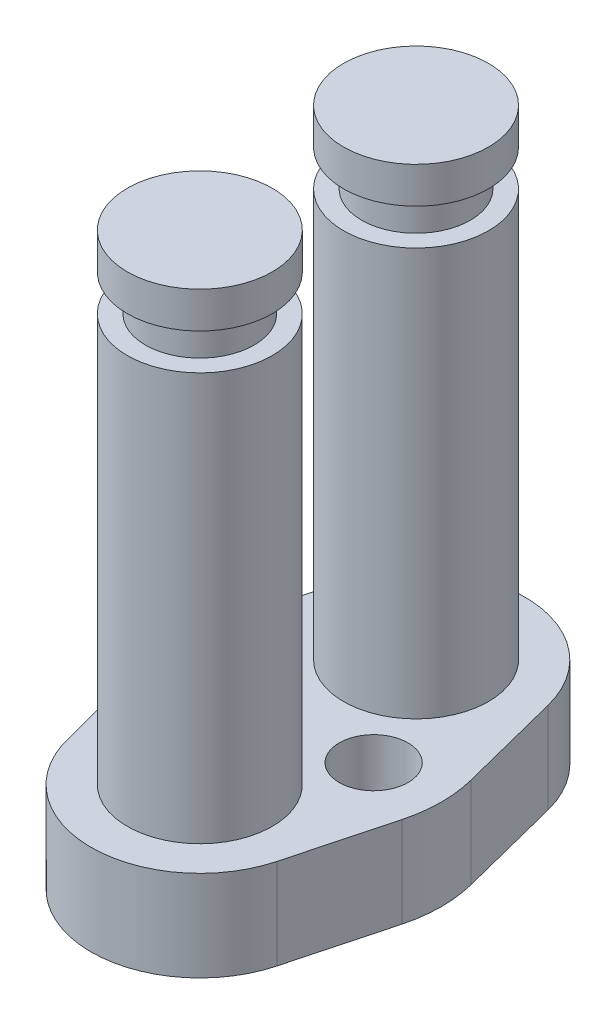
ISO-10303-21;
HEADER;
FILE_DESCRIPTION(('STEP AP214'),'2;1');
FILE_NAME('part.step','',(''),(''),'','','');
FILE_SCHEMA(('AUTOMOTIVE_DESIGN { 1 0 10303 214 1 1 1 1 }'));
ENDSEC;
DATA;
#1=APPLICATION_CONTEXT('core data for automotive mechanical design processes');
#2=APPLICATION_PROTOCOL_DEFINITION('international standard','automotive_design',2000,#1);
#3=PRODUCT_CONTEXT('',#1,'mechanical');
#4=PRODUCT('Part','Part','',(#3));
#5=PRODUCT_RELATED_PRODUCT_CATEGORY('part','',(#4));
#6=PRODUCT_DEFINITION_FORMATION('','',#4);
#7=PRODUCT_DEFINITION_CONTEXT('part definition',#1,'design');
#8=PRODUCT_DEFINITION('design','',#6,#7);
#9=PRODUCT_DEFINITION_SHAPE('','',#8);
#10=(LENGTH_UNIT() NAMED_UNIT(*) SI_UNIT(.MILLI.,.METRE.));
#11=(NAMED_UNIT(*) PLANE_ANGLE_UNIT() SI_UNIT($,.RADIAN.));
#12=(NAMED_UNIT(*) SI_UNIT($,.STERADIAN.) SOLID_ANGLE_UNIT());
#13=UNCERTAINTY_MEASURE_WITH_UNIT(LENGTH_MEASURE(1.E-05),#10,'distance_accuracy_value','');
#14=(GEOMETRIC_REPRESENTATION_CONTEXT(3) GLOBAL_UNCERTAINTY_ASSIGNED_CONTEXT((#13)) GLOBAL_UNIT_ASSIGNED_CONTEXT((#10,
#11,#12)) REPRESENTATION_CONTEXT('',''));
#15=CARTESIAN_POINT('',(0.,0.,0.));
#16=DIRECTION('',(0.,0.,1.));
#17=DIRECTION('',(1.,0.,0.));
#18=AXIS2_PLACEMENT_3D('',#15,#16,#17);
#19=CARTESIAN_POINT('',(10.7914021707681,5.,-2.7425994459952));
#20=DIRECTION('',(-0.969189489495146,0.,0.246316328025849));
#21=DIRECTION('',(0.246316328025849,0.,0.969189489495146));
#22=AXIS2_PLACEMENT_3D('',#19,#20,#21);
#23=PLANE('',#22);
#24=DIRECTION('',(-0.246316328025849,0.,-0.969189489495146));
#25=VECTOR('',#24,1.);
#26=CARTESIAN_POINT('',(10.7914021707681,0.,-2.7425994459952));
#27=LINE('',#26,#25);
#28=CARTESIAN_POINT('',(11.0189211712136,0.,-1.84737246019386));
#29=VERTEX_POINT('',#28);
#30=CARTESIAN_POINT('',(9.56513693697088,0.,-7.56762824313138));
#31=VERTEX_POINT('',#30);
#32=EDGE_CURVE('E133',#29,#31,#27,.T.);
#33=ORIENTED_EDGE('',*,*,#32,.T.);
#34=DIRECTION('',(0.,-1.,0.));
#35=VECTOR('',#34,1.);
#36=CARTESIAN_POINT('',(9.56513693697088,5.,-7.56762824313138));
#37=LINE('',#36,#35);
#38=CARTESIAN_POINT('',(9.56513693697088,5.,-7.56762824313138));
#39=VERTEX_POINT('',#38);
#40=EDGE_CURVE('E38',#39,#31,#37,.T.);
#41=ORIENTED_EDGE('',*,*,#40,.F.);
#42=DIRECTION('',(-0.246316328025849,0.,-0.969189489495146));
#43=VECTOR('',#42,1.);
#44=CARTESIAN_POINT('',(10.7914021707681,5.,-2.7425994459952));
#45=LINE('',#44,#43);
#46=CARTESIAN_POINT('',(11.0189211712136,5.,-1.84737246019386));
#47=VERTEX_POINT('',#46);
#48=EDGE_CURVE('E149',#47,#39,#45,.T.);
#49=ORIENTED_EDGE('',*,*,#48,.F.);
#50=DIRECTION('',(0.,-1.,0.));
#51=VECTOR('',#50,1.);
#52=CARTESIAN_POINT('',(11.0189211712136,5.,-1.84737246019386));
#53=LINE('',#52,#51);
#54=EDGE_CURVE('E129',#47,#29,#53,.T.);
#55=ORIENTED_EDGE('',*,*,#54,.T.);
#56=EDGE_LOOP('',(#33,#41,#49,#55));
#57=FACE_BOUND('',#56,.T.);
#58=ADVANCED_FACE('F35',(#57),#23,.F.);
#59=CARTESIAN_POINT('',(3.75,5.,-6.08973027497629));
#60=DIRECTION('',(0.,-1.,0.));
#61=DIRECTION('',(0.,0.,-1.));
#62=AXIS2_PLACEMENT_3D('',#59,#60,#61);
#63=CYLINDRICAL_SURFACE('',#62,6.);
#64=CARTESIAN_POINT('',(3.75,0.,-6.08973027497629));
#65=DIRECTION('',(0.,1.,0.));
#66=DIRECTION('',(0.,0.,1.));
#67=AXIS2_PLACEMENT_3D('',#64,#65,#66);
#68=CIRCLE('',#67,6.);
#69=CARTESIAN_POINT('',(-2.06513693697088,0.,-7.56762824313138));
#70=VERTEX_POINT('',#69);
#71=EDGE_CURVE('E136',#31,#70,#68,.T.);
#72=ORIENTED_EDGE('',*,*,#71,.T.);
#73=DIRECTION('',(0.,-1.,0.));
#74=VECTOR('',#73,1.);
#75=CARTESIAN_POINT('',(-2.06513693697088,5.,-7.56762824313138));
#76=LINE('',#75,#74);
#77=CARTESIAN_POINT('',(-2.06513693697088,5.,-7.56762824313138));
#78=VERTEX_POINT('',#77);
#79=EDGE_CURVE('E158',#78,#70,#76,.T.);
#80=ORIENTED_EDGE('',*,*,#79,.F.);
#81=CARTESIAN_POINT('',(3.75,5.,-6.08973027497629));
#82=DIRECTION('',(0.,1.,0.));
#83=DIRECTION('',(0.,0.,1.));
#84=AXIS2_PLACEMENT_3D('',#81,#82,#83);
#85=CIRCLE('',#84,6.);
#86=EDGE_CURVE('E93',#39,#78,#85,.T.);
#87=ORIENTED_EDGE('',*,*,#86,.F.);
#88=ORIENTED_EDGE('',*,*,#40,.T.);
#89=EDGE_LOOP('',(#72,#80,#87,#88));
#90=FACE_BOUND('',#89,.T.);
#91=ADVANCED_FACE('F214',(#90),#63,.T.);
#92=CARTESIAN_POINT('',(-3.74644017165911,5.,-0.95214547439252));
#93=DIRECTION('',(0.969189489495147,0.,0.246316328025848));
#94=DIRECTION('',(0.246316328025848,0.,-0.969189489495147));
#95=AXIS2_PLACEMENT_3D('',#92,#93,#94);
#96=PLANE('',#95);
#97=DIRECTION('',(-0.246316328025848,0.,0.969189489495147));
#98=VECTOR('',#97,1.);
#99=CARTESIAN_POINT('',(-3.74644017165911,0.,-0.95214547439252));
#100=LINE('',#99,#98);
#101=CARTESIAN_POINT('',(-3.5189211712136,0.,-1.84737246019386));
#102=VERTEX_POINT('',#101);
#103=EDGE_CURVE('E139',#70,#102,#100,.T.);
#104=ORIENTED_EDGE('',*,*,#103,.T.);
#105=DIRECTION('',(0.,-1.,0.));
#106=VECTOR('',#105,1.);
#107=CARTESIAN_POINT('',(-3.5189211712136,5.,-1.84737246019386));
#108=LINE('',#107,#106);
#109=CARTESIAN_POINT('',(-3.5189211712136,5.,-1.84737246019386));
#110=VERTEX_POINT('',#109);
#111=EDGE_CURVE('E156',#110,#102,#108,.T.);
#112=ORIENTED_EDGE('',*,*,#111,.F.);
#113=DIRECTION('',(-0.246316328025848,0.,0.969189489495147));
#114=VECTOR('',#113,1.);
#115=CARTESIAN_POINT('',(-3.74644017165911,5.,-0.95214547439252));
#116=LINE('',#115,#114);
#117=EDGE_CURVE('E184',#78,#110,#116,.T.);
#118=ORIENTED_EDGE('',*,*,#117,.F.);
#119=ORIENTED_EDGE('',*,*,#79,.T.);
#120=EDGE_LOOP('',(#104,#112,#118,#119));
#121=FACE_BOUND('',#120,.T.);
#122=ADVANCED_FACE('F218',(#121),#96,.F.);
#123=CARTESIAN_POINT('',(3.75,5.,0.));
#124=DIRECTION('',(0.,-1.,0.));
#125=DIRECTION('',(0.,0.,-1.));
#126=AXIS2_PLACEMENT_3D('',#123,#124,#125);
#127=CYLINDRICAL_SURFACE('',#126,7.5);
#128=CARTESIAN_POINT('',(3.75,0.,0.));
#129=DIRECTION('',(0.,1.,0.));
#130=DIRECTION('',(0.,0.,1.));
#131=AXIS2_PLACEMENT_3D('',#128,#129,#130);
#132=CIRCLE('',#131,7.5);
#133=CARTESIAN_POINT('',(-3.49342660554137,0.,1.94493470587972));
#134=VERTEX_POINT('',#133);
#135=EDGE_CURVE('E141',#102,#134,#132,.T.);
#136=ORIENTED_EDGE('',*,*,#135,.T.);
#137=DIRECTION('',(0.,-1.,0.));
#138=VECTOR('',#137,1.);
#139=CARTESIAN_POINT('',(-3.49342660554137,5.,1.94493470587972));
#140=LINE('',#139,#138);
#141=CARTESIAN_POINT('',(-3.49342660554137,5.,1.94493470587972));
#142=VERTEX_POINT('',#141);
#143=EDGE_CURVE('E153',#142,#134,#140,.T.);
#144=ORIENTED_EDGE('',*,*,#143,.F.);
#145=CARTESIAN_POINT('',(3.75,5.,0.));
#146=DIRECTION('',(0.,1.,0.));
#147=DIRECTION('',(0.,0.,1.));
#148=AXIS2_PLACEMENT_3D('',#145,#146,#147);
#149=CIRCLE('',#148,7.5);
#150=EDGE_CURVE('E186',#110,#142,#149,.T.);
#151=ORIENTED_EDGE('',*,*,#150,.F.);
#152=ORIENTED_EDGE('',*,*,#111,.T.);
#153=EDGE_LOOP('',(#136,#144,#151,#152));
#154=FACE_BOUND('',#153,.T.);
#155=ADVANCED_FACE('F191',(#154),#127,.T.);
#156=CARTESIAN_POINT('',(-3.7456113395504,5.,1.00573525290572));
#157=DIRECTION('',(0.965790214072183,0.,-0.259324627450629));
#158=DIRECTION('',(-0.259324627450629,0.,-0.965790214072183));
#159=AXIS2_PLACEMENT_3D('',#156,#157,#158);
#160=PLANE('',#159);
#161=DIRECTION('',(0.259324627450629,0.,0.965790214072183));
#162=VECTOR('',#161,1.);
#163=CARTESIAN_POINT('',(-3.7456113395504,0.,1.00573525290572));
#164=LINE('',#163,#162);
#165=CARTESIAN_POINT('',(-1.92167348288411,0.,7.79853912333431));
#166=VERTEX_POINT('',#165);
#167=EDGE_CURVE('E143',#134,#166,#164,.T.);
#168=ORIENTED_EDGE('',*,*,#167,.T.);
#169=DIRECTION('',(0.,-1.,0.));
#170=VECTOR('',#169,1.);
#171=CARTESIAN_POINT('',(-1.92167348288411,5.,7.79853912333431));
#172=LINE('',#171,#170);
#173=CARTESIAN_POINT('',(-1.92167348288411,5.,7.79853912333431));
#174=VERTEX_POINT('',#173);
#175=EDGE_CURVE('E125',#174,#166,#172,.T.);
#176=ORIENTED_EDGE('',*,*,#175,.F.);
#177=DIRECTION('',(0.259324627450629,0.,0.965790214072183));
#178=VECTOR('',#177,1.);
#179=CARTESIAN_POINT('',(-3.7456113395504,5.,1.00573525290572));
#180=LINE('',#179,#178);
#181=EDGE_CURVE('E112',#142,#174,#180,.T.);
#182=ORIENTED_EDGE('',*,*,#181,.F.);
#183=ORIENTED_EDGE('',*,*,#143,.T.);
#184=EDGE_LOOP('',(#168,#176,#182,#183));
#185=FACE_BOUND('',#184,.T.);
#186=ADVANCED_FACE('F195',(#185),#160,.F.);
#187=CARTESIAN_POINT('',(3.75,5.,5.84095900912463));
#188=DIRECTION('',(0.,-1.,0.));
#189=DIRECTION('',(0.,0.,-1.));
#190=AXIS2_PLACEMENT_3D('',#187,#188,#189);
#191=CYLINDRICAL_SURFACE('',#190,6.);
#192=CARTESIAN_POINT('',(3.75,0.,5.84095900912463));
#193=DIRECTION('',(0.,1.,0.));
#194=DIRECTION('',(0.,0.,1.));
#195=AXIS2_PLACEMENT_3D('',#192,#193,#194);
#196=CIRCLE('',#195,6.);
#197=CARTESIAN_POINT('',(9.54877601505246,0.,7.38180187173338));
#198=VERTEX_POINT('',#197);
#199=EDGE_CURVE('E121',#166,#198,#196,.T.);
#200=ORIENTED_EDGE('',*,*,#199,.T.);
#201=DIRECTION('',(0.,-1.,0.));
#202=VECTOR('',#201,1.);
#203=CARTESIAN_POINT('',(9.54877601505246,5.,7.38180187173338));
#204=LINE('',#203,#202);
#205=CARTESIAN_POINT('',(9.54877601505246,5.,7.38180187173338));
#206=VERTEX_POINT('',#205);
#207=EDGE_CURVE('E118',#206,#198,#204,.T.);
#208=ORIENTED_EDGE('',*,*,#207,.F.);
#209=CARTESIAN_POINT('',(3.75,5.,5.84095900912463));
#210=DIRECTION('',(0.,1.,0.));
#211=DIRECTION('',(0.,0.,1.));
#212=AXIS2_PLACEMENT_3D('',#209,#210,#211);
#213=CIRCLE('',#212,6.);
#214=EDGE_CURVE('E106',#174,#206,#213,.T.);
#215=ORIENTED_EDGE('',*,*,#214,.F.);
#216=ORIENTED_EDGE('',*,*,#175,.T.);
#217=EDGE_LOOP('',(#200,#208,#215,#216));
#218=FACE_BOUND('',#217,.T.);
#219=ADVANCED_FACE('F119',(#218),#191,.T.);
#220=CARTESIAN_POINT('',(10.7511578597268,5.,2.8567830193714));
#221=DIRECTION('',(0.96646266917541,0.,0.256807143768126));
#222=DIRECTION('',(0.256807143768126,0.,-0.96646266917541));
#223=AXIS2_PLACEMENT_3D('',#220,#221,#222);
#224=PLANE('',#223);
#225=DIRECTION('',(-0.256807143768126,0.,0.96646266917541));
#226=VECTOR('',#225,1.);
#227=CARTESIAN_POINT('',(10.7511578597268,0.,2.8567830193714));
#228=LINE('',#227,#226);
#229=CARTESIAN_POINT('',(10.9984700188156,0.,1.92605357826094));
#230=VERTEX_POINT('',#229);
#231=EDGE_CURVE('E146',#230,#198,#228,.T.);
#232=ORIENTED_EDGE('',*,*,#231,.F.);
#233=DIRECTION('',(0.,-1.,0.));
#234=VECTOR('',#233,1.);
#235=CARTESIAN_POINT('',(10.9984700188156,5.,1.92605357826094));
#236=LINE('',#235,#234);
#237=CARTESIAN_POINT('',(10.9984700188156,5.,1.92605357826094));
#238=VERTEX_POINT('',#237);
#239=EDGE_CURVE('E81',#238,#230,#236,.T.);
#240=ORIENTED_EDGE('',*,*,#239,.F.);
#241=DIRECTION('',(-0.256807143768126,0.,0.96646266917541));
#242=VECTOR('',#241,1.);
#243=CARTESIAN_POINT('',(10.7511578597268,5.,2.8567830193714));
#244=LINE('',#243,#242);
#245=EDGE_CURVE('E110',#238,#206,#244,.T.);
#246=ORIENTED_EDGE('',*,*,#245,.T.);
#247=ORIENTED_EDGE('',*,*,#207,.T.);
#248=EDGE_LOOP('',(#232,#240,#246,#247));
#249=FACE_BOUND('',#248,.T.);
#250=ADVANCED_FACE('F127',(#249),#224,.T.);
#251=CARTESIAN_POINT('',(3.75,5.,0.));
#252=DIRECTION('',(0.,-1.,0.));
#253=DIRECTION('',(0.,0.,-1.));
#254=AXIS2_PLACEMENT_3D('',#251,#252,#253);
#255=CYLINDRICAL_SURFACE('',#254,7.5);
#256=CARTESIAN_POINT('',(3.75,0.,0.));
#257=DIRECTION('',(0.,1.,0.));
#258=DIRECTION('',(0.,0.,1.));
#259=AXIS2_PLACEMENT_3D('',#256,#257,#258);
#260=CIRCLE('',#259,7.5);
#261=EDGE_CURVE('E84',#230,#29,#260,.T.);
#262=ORIENTED_EDGE('',*,*,#261,.T.);
#263=ORIENTED_EDGE('',*,*,#54,.F.);
#264=CARTESIAN_POINT('',(3.75,5.,0.));
#265=DIRECTION('',(0.,1.,0.));
#266=DIRECTION('',(0.,0.,1.));
#267=AXIS2_PLACEMENT_3D('',#264,#265,#266);
#268=CIRCLE('',#267,7.5);
#269=EDGE_CURVE('E53',#238,#47,#268,.T.);
#270=ORIENTED_EDGE('',*,*,#269,.F.);
#271=ORIENTED_EDGE('',*,*,#239,.T.);
#272=EDGE_LOOP('',(#262,#263,#270,#271));
#273=FACE_BOUND('',#272,.T.);
#274=ADVANCED_FACE('F201',(#273),#255,.T.);
#275=CARTESIAN_POINT('',(0.,5.,0.));
#276=DIRECTION('',(0.,1.,0.));
#277=DIRECTION('',(0.,0.,1.));
#278=AXIS2_PLACEMENT_3D('',#275,#276,#277);
#279=PLANE('',#278);
#280=CARTESIAN_POINT('',(0.,5.,0.));
#281=DIRECTION('',(0.,1.,0.));
#282=DIRECTION('',(0.,0.,1.));
#283=AXIS2_PLACEMENT_3D('',#280,#281,#282);
#284=CIRCLE('',#283,1.89864999999999);
#285=CARTESIAN_POINT('',(0.,5.,1.89864999999999));
#286=VERTEX_POINT('',#285);
#287=EDGE_CURVE('E401',#286,#286,#284,.T.);
#288=ORIENTED_EDGE('',*,*,#287,.F.);
#289=EDGE_LOOP('',(#288));
#290=FACE_BOUND('',#289,.T.);
#291=CARTESIAN_POINT('',(7.5,5.,0.));
#292=DIRECTION('',(0.,1.,0.));
#293=DIRECTION('',(0.,0.,1.));
#294=AXIS2_PLACEMENT_3D('',#291,#292,#293);
#295=CIRCLE('',#294,1.89864999999999);
#296=CARTESIAN_POINT('',(7.5,5.,1.89864999999999));
#297=VERTEX_POINT('',#296);
#298=EDGE_CURVE('E403',#297,#297,#295,.T.);
#299=ORIENTED_EDGE('',*,*,#298,.F.);
#300=EDGE_LOOP('',(#299));
#301=FACE_BOUND('',#300,.T.);
#302=CARTESIAN_POINT('',(3.75,5.,-6.08973027497629));
#303=DIRECTION('',(0.,1.,0.));
#304=DIRECTION('',(0.,0.,1.));
#305=AXIS2_PLACEMENT_3D('',#302,#303,#304);
#306=CIRCLE('',#305,4.);
#307=CARTESIAN_POINT('',(3.75,5.,-10.0897302749763));
#308=VERTEX_POINT('',#307);
#309=EDGE_CURVE('E175',#308,#308,#306,.T.);
#310=ORIENTED_EDGE('',*,*,#309,.F.);
#311=EDGE_LOOP('',(#310));
#312=FACE_BOUND('',#311,.T.);
#313=CARTESIAN_POINT('',(3.75,5.,5.84095900912463));
#314=DIRECTION('',(0.,1.,0.));
#315=DIRECTION('',(0.,0.,1.));
#316=AXIS2_PLACEMENT_3D('',#313,#314,#315);
#317=CIRCLE('',#316,4.);
#318=CARTESIAN_POINT('',(3.75,5.,1.84095900912463));
#319=VERTEX_POINT('',#318);
#320=EDGE_CURVE('E174',#319,#319,#317,.T.);
#321=ORIENTED_EDGE('',*,*,#320,.F.);
#322=EDGE_LOOP('',(#321));
#323=FACE_BOUND('',#322,.T.);
#324=ORIENTED_EDGE('',*,*,#48,.T.);
#325=ORIENTED_EDGE('',*,*,#86,.T.);
#326=ORIENTED_EDGE('',*,*,#117,.T.);
#327=ORIENTED_EDGE('',*,*,#150,.T.);
#328=ORIENTED_EDGE('',*,*,#181,.T.);
#329=ORIENTED_EDGE('',*,*,#214,.T.);
#330=ORIENTED_EDGE('',*,*,#245,.F.);
#331=ORIENTED_EDGE('',*,*,#269,.T.);
#332=EDGE_LOOP('',(#324,#325,#326,#327,#328,#329,#330,#331));
#333=FACE_BOUND('',#332,.T.);
#334=ADVANCED_FACE('F108',(#290,#301,#312,#323,#333),#279,.T.);
#335=CARTESIAN_POINT('',(0.,0.,0.));
#336=DIRECTION('',(0.,1.,0.));
#337=DIRECTION('',(0.,0.,1.));
#338=AXIS2_PLACEMENT_3D('',#335,#336,#337);
#339=PLANE('',#338);
#340=CARTESIAN_POINT('',(0.,0.,0.));
#341=DIRECTION('',(0.,1.,0.));
#342=DIRECTION('',(0.,0.,1.));
#343=AXIS2_PLACEMENT_3D('',#340,#341,#342);
#344=CIRCLE('',#343,1.89865);
#345=CARTESIAN_POINT('',(0.,0.,1.89865));
#346=VERTEX_POINT('',#345);
#347=EDGE_CURVE('E398',#346,#346,#344,.T.);
#348=ORIENTED_EDGE('',*,*,#347,.T.);
#349=EDGE_LOOP('',(#348));
#350=FACE_BOUND('',#349,.T.);
#351=CARTESIAN_POINT('',(7.5,0.,0.));
#352=DIRECTION('',(0.,1.,0.));
#353=DIRECTION('',(0.,0.,1.));
#354=AXIS2_PLACEMENT_3D('',#351,#352,#353);
#355=CIRCLE('',#354,1.89865);
#356=CARTESIAN_POINT('',(7.5,0.,1.89865));
#357=VERTEX_POINT('',#356);
#358=EDGE_CURVE('E408',#357,#357,#355,.T.);
#359=ORIENTED_EDGE('',*,*,#358,.T.);
#360=EDGE_LOOP('',(#359));
#361=FACE_BOUND('',#360,.T.);
#362=ORIENTED_EDGE('',*,*,#32,.F.);
#363=ORIENTED_EDGE('',*,*,#261,.F.);
#364=ORIENTED_EDGE('',*,*,#231,.T.);
#365=ORIENTED_EDGE('',*,*,#199,.F.);
#366=ORIENTED_EDGE('',*,*,#167,.F.);
#367=ORIENTED_EDGE('',*,*,#135,.F.);
#368=ORIENTED_EDGE('',*,*,#103,.F.);
#369=ORIENTED_EDGE('',*,*,#71,.F.);
#370=EDGE_LOOP('',(#362,#363,#364,#365,#366,#367,#368,#369));
#371=FACE_BOUND('',#370,.T.);
#372=ADVANCED_FACE('F198',(#350,#361,#371),#339,.F.);
#373=CARTESIAN_POINT('',(3.75,27.5,5.84095900912463));
#374=DIRECTION('',(0.,-1.,0.));
#375=DIRECTION('',(0.,0.,-1.));
#376=AXIS2_PLACEMENT_3D('',#373,#374,#375);
#377=CYLINDRICAL_SURFACE('',#376,4.);
#378=CARTESIAN_POINT('',(3.75,27.5,5.84095900912463));
#379=DIRECTION('',(0.,1.,0.));
#380=DIRECTION('',(0.,0.,1.));
#381=AXIS2_PLACEMENT_3D('',#378,#379,#380);
#382=CIRCLE('',#381,4.);
#383=CARTESIAN_POINT('',(3.75,27.5,1.84095900912463));
#384=VERTEX_POINT('',#383);
#385=EDGE_CURVE('E137',#384,#384,#382,.T.);
#386=CARTESIAN_POINT('',(3.75,27.5,1.84095900912463));
#387=CARTESIAN_POINT('',(3.75,27.265625,1.84095900912463));
#388=CARTESIAN_POINT('',(3.75,27.03125,1.84095900912463));
#389=CARTESIAN_POINT('',(3.75,26.5625,1.84095900912463));
#390=CARTESIAN_POINT('',(3.75,26.328125,1.84095900912463));
#391=CARTESIAN_POINT('',(3.75,25.859375,1.84095900912463));
#392=CARTESIAN_POINT('',(3.75,25.625,1.84095900912463));
#393=CARTESIAN_POINT('',(3.75,25.15625,1.84095900912463));
#394=CARTESIAN_POINT('',(3.75,24.921875,1.84095900912463));
#395=CARTESIAN_POINT('',(3.75,24.453125,1.84095900912463));
#396=CARTESIAN_POINT('',(3.75,24.21875,1.84095900912463));
#397=CARTESIAN_POINT('',(3.75,23.75,1.84095900912463));
#398=CARTESIAN_POINT('',(3.75,23.515625,1.84095900912463));
#399=CARTESIAN_POINT('',(3.75,23.046875,1.84095900912463));
#400=CARTESIAN_POINT('',(3.75,22.8125,1.84095900912463));
#401=CARTESIAN_POINT('',(3.75,22.34375,1.84095900912463));
#402=CARTESIAN_POINT('',(3.75,22.109375,1.84095900912463));
#403=CARTESIAN_POINT('',(3.75,21.640625,1.84095900912463));
#404=CARTESIAN_POINT('',(3.75,21.40625,1.84095900912463));
#405=CARTESIAN_POINT('',(3.75,20.9375,1.84095900912463));
#406=CARTESIAN_POINT('',(3.75,20.703125,1.84095900912463));
#407=CARTESIAN_POINT('',(3.75,20.234375,1.84095900912463));
#408=CARTESIAN_POINT('',(3.75,20.,1.84095900912463));
#409=CARTESIAN_POINT('',(3.75,19.53125,1.84095900912463));
#410=CARTESIAN_POINT('',(3.75,19.296875,1.84095900912463));
#411=CARTESIAN_POINT('',(3.75,18.828125,1.84095900912463));
#412=CARTESIAN_POINT('',(3.75,18.59375,1.84095900912463));
#413=CARTESIAN_POINT('',(3.75,18.125,1.84095900912463));
#414=CARTESIAN_POINT('',(3.75,17.890625,1.84095900912463));
#415=CARTESIAN_POINT('',(3.75,17.421875,1.84095900912463));
#416=CARTESIAN_POINT('',(3.75,17.1875,1.84095900912463));
#417=CARTESIAN_POINT('',(3.75,16.71875,1.84095900912463));
#418=CARTESIAN_POINT('',(3.75,16.484375,1.84095900912463));
#419=CARTESIAN_POINT('',(3.75,16.015625,1.84095900912463));
#420=CARTESIAN_POINT('',(3.75,15.78125,1.84095900912463));
#421=CARTESIAN_POINT('',(3.75,15.3125,1.84095900912463));
#422=CARTESIAN_POINT('',(3.75,15.078125,1.84095900912463));
#423=CARTESIAN_POINT('',(3.75,14.609375,1.84095900912463));
#424=CARTESIAN_POINT('',(3.75,14.375,1.84095900912463));
#425=CARTESIAN_POINT('',(3.75,13.90625,1.84095900912463));
#426=CARTESIAN_POINT('',(3.75,13.671875,1.84095900912463));
#427=CARTESIAN_POINT('',(3.75,13.203125,1.84095900912463));
#428=CARTESIAN_POINT('',(3.75,12.96875,1.84095900912463));
#429=CARTESIAN_POINT('',(3.75,12.5,1.84095900912463));
#430=CARTESIAN_POINT('',(3.75,12.265625,1.84095900912463));
#431=CARTESIAN_POINT('',(3.75,11.796875,1.84095900912463));
#432=CARTESIAN_POINT('',(3.75,11.5625,1.84095900912463));
#433=CARTESIAN_POINT('',(3.75,11.09375,1.84095900912463));
#434=CARTESIAN_POINT('',(3.75,10.859375,1.84095900912463));
#435=CARTESIAN_POINT('',(3.75,10.390625,1.84095900912463));
#436=CARTESIAN_POINT('',(3.75,10.15625,1.84095900912463));
#437=CARTESIAN_POINT('',(3.75,9.6875,1.84095900912463));
#438=CARTESIAN_POINT('',(3.75,9.453125,1.84095900912463));
#439=CARTESIAN_POINT('',(3.75,8.984375,1.84095900912463));
#440=CARTESIAN_POINT('',(3.75,8.75,1.84095900912463));
#441=CARTESIAN_POINT('',(3.75,8.28125,1.84095900912463));
#442=CARTESIAN_POINT('',(3.75,8.046875,1.84095900912463));
#443=CARTESIAN_POINT('',(3.75,7.578125,1.84095900912463));
#444=CARTESIAN_POINT('',(3.75,7.34375,1.84095900912463));
#445=CARTESIAN_POINT('',(3.75,6.875,1.84095900912463));
#446=CARTESIAN_POINT('',(3.75,6.640625,1.84095900912463));
#447=CARTESIAN_POINT('',(3.75,6.171875,1.84095900912463));
#448=CARTESIAN_POINT('',(3.75,5.9375,1.84095900912463));
#449=CARTESIAN_POINT('',(3.75,5.46875,1.84095900912463));
#450=CARTESIAN_POINT('',(3.75,5.234375,1.84095900912463));
#451=CARTESIAN_POINT('',(3.75,5.,1.84095900912463));
#452=B_SPLINE_CURVE_WITH_KNOTS('',3,(#386,#387,#388,#389,#390,#391,#392,#393,#394,#395,#396,
#397,#398,#399,#400,#401,#402,#403,#404,#405,#406,#407,#408,#409,#410,#411,#412,#413,#414,#415,
#416,#417,#418,#419,#420,#421,#422,#423,#424,#425,#426,#427,#428,#429,#430,#431,#432,#433,#434,
#435,#436,#437,#438,#439,#440,#441,#442,#443,#444,#445,#446,#447,#448,#449,#450,#451),
.UNSPECIFIED.,.F.,.F.,(4,2,2,2,2,2,2,2,2,2,2,2,2,2,2,2,2,2,2,2,2,2,2,2,2,2,2,2,2,2,2,2,4),(0.,
0.703125000000002,1.40625,2.109375,2.8125,3.515625,4.21875,4.921875,5.625,6.328125,7.03125,
7.734375,8.4375,9.140625,9.84375,10.546875,11.25,11.953125,12.65625,13.359375,14.0625,14.765625,
15.46875,16.171875,16.875,17.578125,18.28125,18.984375,19.6875,20.390625,21.09375,21.796875,
22.5),.UNSPECIFIED.);
#453=EDGE_CURVE('BSEAM247',#384,#319,#452,.T.);
#454=ORIENTED_EDGE('',*,*,#385,.F.);
#455=ORIENTED_EDGE('',*,*,#320,.T.);
#456=ORIENTED_EDGE('',*,*,#453,.T.);
#457=ORIENTED_EDGE('',*,*,#453,.F.);
#458=EDGE_LOOP('',(#454,#456,#455,#457));
#459=FACE_BOUND('',#458,.T.);
#460=ADVANCED_FACE('F247',(#459),#377,.T.);
#461=CARTESIAN_POINT('',(3.75,27.5,5.84095900912463));
#462=DIRECTION('',(0.,1.,0.));
#463=DIRECTION('',(0.,0.,1.));
#464=AXIS2_PLACEMENT_3D('',#461,#462,#463);
#465=PLANE('',#464);
#466=CARTESIAN_POINT('',(3.75,27.5,5.84095900912463));
#467=DIRECTION('',(0.,1.,0.));
#468=DIRECTION('',(0.,0.,1.));
#469=AXIS2_PLACEMENT_3D('',#466,#467,#468);
#470=CIRCLE('',#469,3.);
#471=CARTESIAN_POINT('',(3.75,27.5,8.84095900912463));
#472=VERTEX_POINT('',#471);
#473=EDGE_CURVE('E44',#472,#472,#470,.T.);
#474=ORIENTED_EDGE('',*,*,#473,.F.);
#475=EDGE_LOOP('',(#474));
#476=FACE_BOUND('',#475,.T.);
#477=ORIENTED_EDGE('',*,*,#385,.T.);
#478=EDGE_LOOP('',(#477));
#479=FACE_BOUND('',#478,.T.);
#480=ADVANCED_FACE('F252',(#476,#479),#465,.T.);
#481=CARTESIAN_POINT('',(3.75,27.5,-6.08973027497629));
#482=DIRECTION('',(0.,-1.,0.));
#483=DIRECTION('',(0.,0.,-1.));
#484=AXIS2_PLACEMENT_3D('',#481,#482,#483);
#485=CYLINDRICAL_SURFACE('',#484,4.);
#486=CARTESIAN_POINT('',(3.75,27.5,-6.08973027497629));
#487=DIRECTION('',(0.,1.,0.));
#488=DIRECTION('',(0.,0.,1.));
#489=AXIS2_PLACEMENT_3D('',#486,#487,#488);
#490=CIRCLE('',#489,4.);
#491=CARTESIAN_POINT('',(3.75,27.5,-10.0897302749763));
#492=VERTEX_POINT('',#491);
#493=EDGE_CURVE('E171',#492,#492,#490,.T.);
#494=CARTESIAN_POINT('',(3.75,27.5,-10.0897302749763));
#495=CARTESIAN_POINT('',(3.75,27.265625,-10.0897302749763));
#496=CARTESIAN_POINT('',(3.75,27.03125,-10.0897302749763));
#497=CARTESIAN_POINT('',(3.75,26.5625,-10.0897302749763));
#498=CARTESIAN_POINT('',(3.75,26.328125,-10.0897302749763));
#499=CARTESIAN_POINT('',(3.75,25.859375,-10.0897302749763));
#500=CARTESIAN_POINT('',(3.75,25.625,-10.0897302749763));
#501=CARTESIAN_POINT('',(3.75,25.15625,-10.0897302749763));
#502=CARTESIAN_POINT('',(3.75,24.921875,-10.0897302749763));
#503=CARTESIAN_POINT('',(3.75,24.453125,-10.0897302749763));
#504=CARTESIAN_POINT('',(3.75,24.21875,-10.0897302749763));
#505=CARTESIAN_POINT('',(3.75,23.75,-10.0897302749763));
#506=CARTESIAN_POINT('',(3.75,23.515625,-10.0897302749763));
#507=CARTESIAN_POINT('',(3.75,23.046875,-10.0897302749763));
#508=CARTESIAN_POINT('',(3.75,22.8125,-10.0897302749763));
#509=CARTESIAN_POINT('',(3.75,22.34375,-10.0897302749763));
#510=CARTESIAN_POINT('',(3.75,22.109375,-10.0897302749763));
#511=CARTESIAN_POINT('',(3.75,21.640625,-10.0897302749763));
#512=CARTESIAN_POINT('',(3.75,21.40625,-10.0897302749763));
#513=CARTESIAN_POINT('',(3.75,20.9375,-10.0897302749763));
#514=CARTESIAN_POINT('',(3.75,20.703125,-10.0897302749763));
#515=CARTESIAN_POINT('',(3.75,20.234375,-10.0897302749763));
#516=CARTESIAN_POINT('',(3.75,20.,-10.0897302749763));
#517=CARTESIAN_POINT('',(3.75,19.53125,-10.0897302749763));
#518=CARTESIAN_POINT('',(3.75,19.296875,-10.0897302749763));
#519=CARTESIAN_POINT('',(3.75,18.828125,-10.0897302749763));
#520=CARTESIAN_POINT('',(3.75,18.59375,-10.0897302749763));
#521=CARTESIAN_POINT('',(3.75,18.125,-10.0897302749763));
#522=CARTESIAN_POINT('',(3.75,17.890625,-10.0897302749763));
#523=CARTESIAN_POINT('',(3.75,17.421875,-10.0897302749763));
#524=CARTESIAN_POINT('',(3.75,17.1875,-10.0897302749763));
#525=CARTESIAN_POINT('',(3.75,16.71875,-10.0897302749763));
#526=CARTESIAN_POINT('',(3.75,16.484375,-10.0897302749763));
#527=CARTESIAN_POINT('',(3.75,16.015625,-10.0897302749763));
#528=CARTESIAN_POINT('',(3.75,15.78125,-10.0897302749763));
#529=CARTESIAN_POINT('',(3.75,15.3125,-10.0897302749763));
#530=CARTESIAN_POINT('',(3.75,15.078125,-10.0897302749763));
#531=CARTESIAN_POINT('',(3.75,14.609375,-10.0897302749763));
#532=CARTESIAN_POINT('',(3.75,14.375,-10.0897302749763));
#533=CARTESIAN_POINT('',(3.75,13.90625,-10.0897302749763));
#534=CARTESIAN_POINT('',(3.75,13.671875,-10.0897302749763));
#535=CARTESIAN_POINT('',(3.75,13.203125,-10.0897302749763));
#536=CARTESIAN_POINT('',(3.75,12.96875,-10.0897302749763));
#537=CARTESIAN_POINT('',(3.75,12.5,-10.0897302749763));
#538=CARTESIAN_POINT('',(3.75,12.265625,-10.0897302749763));
#539=CARTESIAN_POINT('',(3.75,11.796875,-10.0897302749763));
#540=CARTESIAN_POINT('',(3.75,11.5625,-10.0897302749763));
#541=CARTESIAN_POINT('',(3.75,11.09375,-10.0897302749763));
#542=CARTESIAN_POINT('',(3.75,10.859375,-10.0897302749763));
#543=CARTESIAN_POINT('',(3.75,10.390625,-10.0897302749763));
#544=CARTESIAN_POINT('',(3.75,10.15625,-10.0897302749763));
#545=CARTESIAN_POINT('',(3.75,9.6875,-10.0897302749763));
#546=CARTESIAN_POINT('',(3.75,9.453125,-10.0897302749763));
#547=CARTESIAN_POINT('',(3.75,8.984375,-10.0897302749763));
#548=CARTESIAN_POINT('',(3.75,8.75,-10.0897302749763));
#549=CARTESIAN_POINT('',(3.75,8.28125,-10.0897302749763));
#550=CARTESIAN_POINT('',(3.75,8.046875,-10.0897302749763));
#551=CARTESIAN_POINT('',(3.75,7.578125,-10.0897302749763));
#552=CARTESIAN_POINT('',(3.75,7.34375,-10.0897302749763));
#553=CARTESIAN_POINT('',(3.75,6.875,-10.0897302749763));
#554=CARTESIAN_POINT('',(3.75,6.640625,-10.0897302749763));
#555=CARTESIAN_POINT('',(3.75,6.171875,-10.0897302749763));
#556=CARTESIAN_POINT('',(3.75,5.9375,-10.0897302749763));
#557=CARTESIAN_POINT('',(3.75,5.46875,-10.0897302749763));
#558=CARTESIAN_POINT('',(3.75,5.234375,-10.0897302749763));
#559=CARTESIAN_POINT('',(3.75,5.,-10.0897302749763));
#560=B_SPLINE_CURVE_WITH_KNOTS('',3,(#494,#495,#496,#497,#498,#499,#500,#501,#502,#503,#504,
#505,#506,#507,#508,#509,#510,#511,#512,#513,#514,#515,#516,#517,#518,#519,#520,#521,#522,#523,
#524,#525,#526,#527,#528,#529,#530,#531,#532,#533,#534,#535,#536,#537,#538,#539,#540,#541,#542,
#543,#544,#545,#546,#547,#548,#549,#550,#551,#552,#553,#554,#555,#556,#557,#558,#559),
.UNSPECIFIED.,.F.,.F.,(4,2,2,2,2,2,2,2,2,2,2,2,2,2,2,2,2,2,2,2,2,2,2,2,2,2,2,2,2,2,2,2,4),(0.,
0.703125000000002,1.40625,2.109375,2.8125,3.515625,4.21875,4.921875,5.625,6.328125,7.03125,
7.734375,8.4375,9.140625,9.84375,10.546875,11.25,11.953125,12.65625,13.359375,14.0625,14.765625,
15.46875,16.171875,16.875,17.578125,18.28125,18.984375,19.6875,20.390625,21.09375,21.796875,
22.5),.UNSPECIFIED.);
#561=EDGE_CURVE('BSEAM262',#492,#308,#560,.T.);
#562=ORIENTED_EDGE('',*,*,#493,.F.);
#563=ORIENTED_EDGE('',*,*,#309,.T.);
#564=ORIENTED_EDGE('',*,*,#561,.T.);
#565=ORIENTED_EDGE('',*,*,#561,.F.);
#566=EDGE_LOOP('',(#562,#564,#563,#565));
#567=FACE_BOUND('',#566,.T.);
#568=ADVANCED_FACE('F262',(#567),#485,.T.);
#569=CARTESIAN_POINT('',(3.75,27.5,-6.08973027497629));
#570=DIRECTION('',(0.,1.,0.));
#571=DIRECTION('',(0.,0.,1.));
#572=AXIS2_PLACEMENT_3D('',#569,#570,#571);
#573=PLANE('',#572);
#574=CARTESIAN_POINT('',(3.75,27.5,-6.08973027497629));
#575=DIRECTION('',(0.,1.,0.));
#576=DIRECTION('',(0.,0.,1.));
#577=AXIS2_PLACEMENT_3D('',#574,#575,#576);
#578=CIRCLE('',#577,3.);
#579=CARTESIAN_POINT('',(3.75,27.5,-3.08973027497629));
#580=VERTEX_POINT('',#579);
#581=EDGE_CURVE('E11',#580,#580,#578,.T.);
#582=ORIENTED_EDGE('',*,*,#581,.F.);
#583=EDGE_LOOP('',(#582));
#584=FACE_BOUND('',#583,.T.);
#585=ORIENTED_EDGE('',*,*,#493,.T.);
#586=EDGE_LOOP('',(#585));
#587=FACE_BOUND('',#586,.T.);
#588=ADVANCED_FACE('F267',(#584,#587),#573,.T.);
#589=CARTESIAN_POINT('',(3.75,29.5,5.84095900912463));
#590=DIRECTION('',(0.,-1.,0.));
#591=DIRECTION('',(0.,0.,-1.));
#592=AXIS2_PLACEMENT_3D('',#589,#590,#591);
#593=CYLINDRICAL_SURFACE('',#592,3.);
#594=CARTESIAN_POINT('',(3.75,29.5,5.84095900912463));
#595=DIRECTION('',(0.,1.,0.));
#596=DIRECTION('',(0.,0.,1.));
#597=AXIS2_PLACEMENT_3D('',#594,#595,#596);
#598=CIRCLE('',#597,3.);
#599=CARTESIAN_POINT('',(3.75,29.5,8.84095900912463));
#600=VERTEX_POINT('',#599);
#601=EDGE_CURVE('E170',#600,#600,#598,.T.);
#602=ORIENTED_EDGE('',*,*,#601,.F.);
#603=EDGE_LOOP('',(#602));
#604=FACE_BOUND('',#603,.T.);
#605=ORIENTED_EDGE('',*,*,#473,.T.);
#606=EDGE_LOOP('',(#605));
#607=FACE_BOUND('',#606,.T.);
#608=ADVANCED_FACE('F284',(#604,#607),#593,.T.);
#609=CARTESIAN_POINT('',(3.75,29.5,-6.08973027497629));
#610=DIRECTION('',(0.,-1.,0.));
#611=DIRECTION('',(0.,0.,-1.));
#612=AXIS2_PLACEMENT_3D('',#609,#610,#611);
#613=CYLINDRICAL_SURFACE('',#612,3.);
#614=CARTESIAN_POINT('',(3.75,29.5,-6.08973027497629));
#615=DIRECTION('',(0.,1.,0.));
#616=DIRECTION('',(0.,0.,1.));
#617=AXIS2_PLACEMENT_3D('',#614,#615,#616);
#618=CIRCLE('',#617,3.);
#619=CARTESIAN_POINT('',(3.75,29.5,-3.08973027497629));
#620=VERTEX_POINT('',#619);
#621=EDGE_CURVE('E421',#620,#620,#618,.T.);
#622=ORIENTED_EDGE('',*,*,#621,.F.);
#623=EDGE_LOOP('',(#622));
#624=FACE_BOUND('',#623,.T.);
#625=ORIENTED_EDGE('',*,*,#581,.T.);
#626=EDGE_LOOP('',(#625));
#627=FACE_BOUND('',#626,.T.);
#628=ADVANCED_FACE('F294',(#624,#627),#613,.T.);
#629=CARTESIAN_POINT('',(3.75,31.5,5.84095900912463));
#630=DIRECTION('',(0.,-1.,0.));
#631=DIRECTION('',(0.,0.,-1.));
#632=AXIS2_PLACEMENT_3D('',#629,#630,#631);
#633=CYLINDRICAL_SURFACE('',#632,4.);
#634=CARTESIAN_POINT('',(3.75,31.5,5.84095900912463));
#635=DIRECTION('',(0.,1.,0.));
#636=DIRECTION('',(0.,0.,1.));
#637=AXIS2_PLACEMENT_3D('',#634,#635,#636);
#638=CIRCLE('',#637,4.);
#639=CARTESIAN_POINT('',(3.75,31.5,9.84095900912463));
#640=VERTEX_POINT('',#639);
#641=EDGE_CURVE('E418',#640,#640,#638,.T.);
#642=ORIENTED_EDGE('',*,*,#641,.F.);
#643=EDGE_LOOP('',(#642));
#644=FACE_BOUND('',#643,.T.);
#645=CARTESIAN_POINT('',(3.75,29.5,5.84095900912463));
#646=DIRECTION('',(0.,1.,0.));
#647=DIRECTION('',(0.,0.,1.));
#648=AXIS2_PLACEMENT_3D('',#645,#646,#647);
#649=CIRCLE('',#648,4.);
#650=CARTESIAN_POINT('',(3.75,29.5,9.84095900912463));
#651=VERTEX_POINT('',#650);
#652=EDGE_CURVE('E415',#651,#651,#649,.T.);
#653=ORIENTED_EDGE('',*,*,#652,.T.);
#654=EDGE_LOOP('',(#653));
#655=FACE_BOUND('',#654,.T.);
#656=ADVANCED_FACE('F304',(#644,#655),#633,.T.);
#657=CARTESIAN_POINT('',(3.75,31.5,5.84095900912463));
#658=DIRECTION('',(0.,1.,0.));
#659=DIRECTION('',(0.,0.,1.));
#660=AXIS2_PLACEMENT_3D('',#657,#658,#659);
#661=PLANE('',#660);
#662=ORIENTED_EDGE('',*,*,#641,.T.);
#663=EDGE_LOOP('',(#662));
#664=FACE_BOUND('',#663,.T.);
#665=ADVANCED_FACE('F314',(#664),#661,.T.);
#666=CARTESIAN_POINT('',(3.75,29.5,5.84095900912463));
#667=DIRECTION('',(0.,1.,0.));
#668=DIRECTION('',(0.,0.,1.));
#669=AXIS2_PLACEMENT_3D('',#666,#667,#668);
#670=PLANE('',#669);
#671=ORIENTED_EDGE('',*,*,#601,.T.);
#672=EDGE_LOOP('',(#671));
#673=FACE_BOUND('',#672,.T.);
#674=ORIENTED_EDGE('',*,*,#652,.F.);
#675=EDGE_LOOP('',(#674));
#676=FACE_BOUND('',#675,.T.);
#677=ADVANCED_FACE('F324',(#673,#676),#670,.F.);
#678=CARTESIAN_POINT('',(3.75,31.5,-6.08973027497629));
#679=DIRECTION('',(0.,-1.,0.));
#680=DIRECTION('',(0.,0.,-1.));
#681=AXIS2_PLACEMENT_3D('',#678,#679,#680);
#682=CYLINDRICAL_SURFACE('',#681,4.);
#683=CARTESIAN_POINT('',(3.75,31.5,-6.08973027497629));
#684=DIRECTION('',(0.,1.,0.));
#685=DIRECTION('',(0.,0.,1.));
#686=AXIS2_PLACEMENT_3D('',#683,#684,#685);
#687=CIRCLE('',#686,4.);
#688=CARTESIAN_POINT('',(3.75,31.5,-2.08973027497629));
#689=VERTEX_POINT('',#688);
#690=EDGE_CURVE('E412',#689,#689,#687,.T.);
#691=ORIENTED_EDGE('',*,*,#690,.F.);
#692=EDGE_LOOP('',(#691));
#693=FACE_BOUND('',#692,.T.);
#694=CARTESIAN_POINT('',(3.75,29.5,-6.08973027497629));
#695=DIRECTION('',(0.,1.,0.));
#696=DIRECTION('',(0.,0.,1.));
#697=AXIS2_PLACEMENT_3D('',#694,#695,#696);
#698=CIRCLE('',#697,4.);
#699=CARTESIAN_POINT('',(3.75,29.5,-2.08973027497629));
#700=VERTEX_POINT('',#699);
#701=EDGE_CURVE('E411',#700,#700,#698,.T.);
#702=ORIENTED_EDGE('',*,*,#701,.T.);
#703=EDGE_LOOP('',(#702));
#704=FACE_BOUND('',#703,.T.);
#705=ADVANCED_FACE('F334',(#693,#704),#682,.T.);
#706=CARTESIAN_POINT('',(3.75,31.5,-6.08973027497629));
#707=DIRECTION('',(0.,1.,0.));
#708=DIRECTION('',(0.,0.,1.));
#709=AXIS2_PLACEMENT_3D('',#706,#707,#708);
#710=PLANE('',#709);
#711=ORIENTED_EDGE('',*,*,#690,.T.);
#712=EDGE_LOOP('',(#711));
#713=FACE_BOUND('',#712,.T.);
#714=ADVANCED_FACE('F344',(#713),#710,.T.);
#715=CARTESIAN_POINT('',(3.75,29.5,-6.08973027497629));
#716=DIRECTION('',(0.,1.,0.));
#717=DIRECTION('',(0.,0.,1.));
#718=AXIS2_PLACEMENT_3D('',#715,#716,#717);
#719=PLANE('',#718);
#720=ORIENTED_EDGE('',*,*,#621,.T.);
#721=EDGE_LOOP('',(#720));
#722=FACE_BOUND('',#721,.T.);
#723=ORIENTED_EDGE('',*,*,#701,.F.);
#724=EDGE_LOOP('',(#723));
#725=FACE_BOUND('',#724,.T.);
#726=ADVANCED_FACE('F354',(#722,#725),#719,.F.);
#727=CARTESIAN_POINT('',(7.5,5.,0.));
#728=DIRECTION('',(0.,1.,0.));
#729=DIRECTION('',(0.,0.,1.));
#730=AXIS2_PLACEMENT_3D('',#727,#728,#729);
#731=CYLINDRICAL_SURFACE('',#730,1.89864999999999);
#732=ORIENTED_EDGE('',*,*,#358,.F.);
#733=EDGE_LOOP('',(#732));
#734=FACE_BOUND('',#733,.T.);
#735=ORIENTED_EDGE('',*,*,#298,.T.);
#736=EDGE_LOOP('',(#735));
#737=FACE_BOUND('',#736,.T.);
#738=ADVANCED_FACE('F363',(#734,#737),#731,.F.);
#739=CARTESIAN_POINT('',(0.,5.,0.));
#740=DIRECTION('',(0.,1.,0.));
#741=DIRECTION('',(0.,0.,1.));
#742=AXIS2_PLACEMENT_3D('',#739,#740,#741);
#743=CYLINDRICAL_SURFACE('',#742,1.89864999999999);
#744=ORIENTED_EDGE('',*,*,#347,.F.);
#745=EDGE_LOOP('',(#744));
#746=FACE_BOUND('',#745,.T.);
#747=ORIENTED_EDGE('',*,*,#287,.T.);
#748=EDGE_LOOP('',(#747));
#749=FACE_BOUND('',#748,.T.);
#750=ADVANCED_FACE('F381',(#746,#749),#743,.F.);
#751=CLOSED_SHELL('',(#58,#91,#122,#155,#186,#219,#250,#274,#334,#372,#460,#480,#568,#588,#608,
#628,#656,#665,#677,#705,#714,#726,#738,#750));
#752=MANIFOLD_SOLID_BREP('B2',#751);
#753=ADVANCED_BREP_SHAPE_REPRESENTATION('',(#18,#752),#14);
#754=SHAPE_DEFINITION_REPRESENTATION(#9,#753);
ENDSEC;
END-ISO-10303-21;
